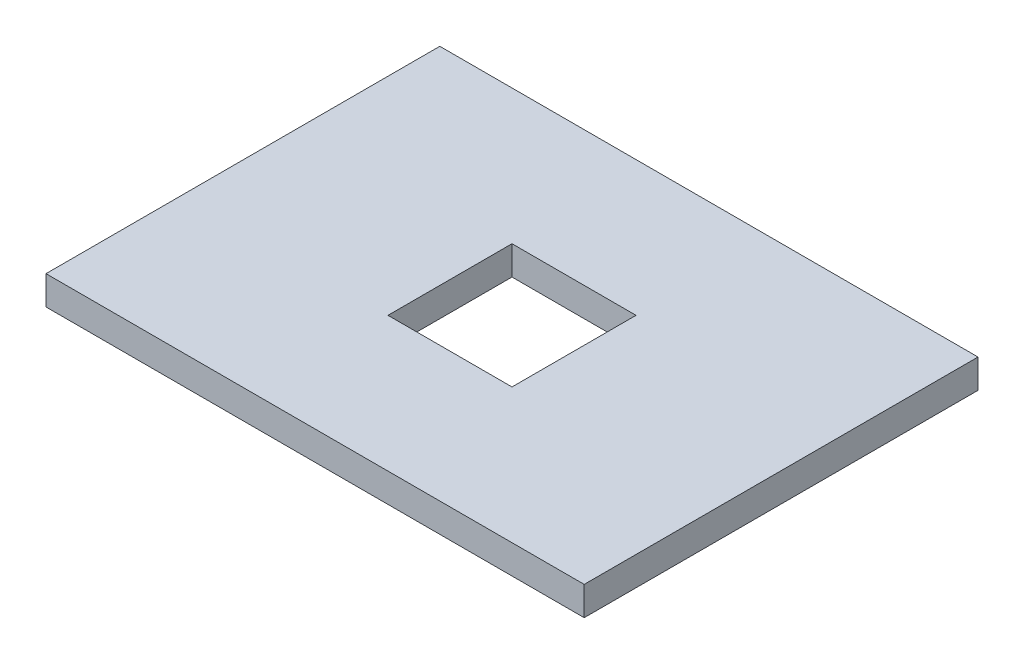
ISO-10303-21;
HEADER;
FILE_DESCRIPTION(('STEP AP214'),'2;1');
FILE_NAME('part.step','',(''),(''),'','','');
FILE_SCHEMA(('AUTOMOTIVE_DESIGN { 1 0 10303 214 1 1 1 1 }'));
ENDSEC;
DATA;
#1=APPLICATION_CONTEXT('core data for automotive mechanical design processes');
#2=APPLICATION_PROTOCOL_DEFINITION('international standard','automotive_design',2000,#1);
#3=PRODUCT_CONTEXT('',#1,'mechanical');
#4=PRODUCT('Part','Part','',(#3));
#5=PRODUCT_RELATED_PRODUCT_CATEGORY('part','',(#4));
#6=PRODUCT_DEFINITION_FORMATION('','',#4);
#7=PRODUCT_DEFINITION_CONTEXT('part definition',#1,'design');
#8=PRODUCT_DEFINITION('design','',#6,#7);
#9=PRODUCT_DEFINITION_SHAPE('','',#8);
#10=(LENGTH_UNIT() NAMED_UNIT(*) SI_UNIT(.MILLI.,.METRE.));
#11=(NAMED_UNIT(*) PLANE_ANGLE_UNIT() SI_UNIT($,.RADIAN.));
#12=(NAMED_UNIT(*) SI_UNIT($,.STERADIAN.) SOLID_ANGLE_UNIT());
#13=UNCERTAINTY_MEASURE_WITH_UNIT(LENGTH_MEASURE(1.E-05),#10,'distance_accuracy_value','');
#14=(GEOMETRIC_REPRESENTATION_CONTEXT(3) GLOBAL_UNCERTAINTY_ASSIGNED_CONTEXT((#13)) GLOBAL_UNIT_ASSIGNED_CONTEXT((#10,
#11,#12)) REPRESENTATION_CONTEXT('',''));
#15=CARTESIAN_POINT('',(0.,0.,0.));
#16=DIRECTION('',(0.,0.,1.));
#17=DIRECTION('',(1.,0.,0.));
#18=AXIS2_PLACEMENT_3D('',#15,#16,#17);
#19=CARTESIAN_POINT('',(130.175,13.97,95.25));
#20=DIRECTION('',(-1.,0.,0.));
#21=DIRECTION('',(0.,0.,1.));
#22=AXIS2_PLACEMENT_3D('',#19,#20,#21);
#23=PLANE('',#22);
#24=DIRECTION('',(0.,0.,-1.));
#25=VECTOR('',#24,1.);
#26=CARTESIAN_POINT('',(130.175,0.,95.25));
#27=LINE('',#26,#25);
#28=CARTESIAN_POINT('',(130.175,0.,95.25));
#29=VERTEX_POINT('',#28);
#30=CARTESIAN_POINT('',(130.175,0.,-95.25));
#31=VERTEX_POINT('',#30);
#32=EDGE_CURVE('E149',#29,#31,#27,.T.);
#33=ORIENTED_EDGE('',*,*,#32,.T.);
#34=DIRECTION('',(0.,-1.,0.));
#35=VECTOR('',#34,1.);
#36=CARTESIAN_POINT('',(130.175,13.97,-95.25));
#37=LINE('',#36,#35);
#38=CARTESIAN_POINT('',(130.175,13.97,-95.25));
#39=VERTEX_POINT('',#38);
#40=EDGE_CURVE('E11',#39,#31,#37,.T.);
#41=ORIENTED_EDGE('',*,*,#40,.F.);
#42=DIRECTION('',(0.,0.,-1.));
#43=VECTOR('',#42,1.);
#44=CARTESIAN_POINT('',(130.175,13.97,95.25));
#45=LINE('',#44,#43);
#46=CARTESIAN_POINT('',(130.175,13.97,95.25));
#47=VERTEX_POINT('',#46);
#48=EDGE_CURVE('E155',#47,#39,#45,.T.);
#49=ORIENTED_EDGE('',*,*,#48,.F.);
#50=DIRECTION('',(0.,-1.,0.));
#51=VECTOR('',#50,1.);
#52=CARTESIAN_POINT('',(130.175,13.97,95.25));
#53=LINE('',#52,#51);
#54=EDGE_CURVE('E169',#47,#29,#53,.T.);
#55=ORIENTED_EDGE('',*,*,#54,.T.);
#56=EDGE_LOOP('',(#33,#41,#49,#55));
#57=FACE_BOUND('',#56,.T.);
#58=ADVANCED_FACE('F41',(#57),#23,.F.);
#59=CARTESIAN_POINT('',(-130.175,13.97,-95.25));
#60=DIRECTION('',(0.,0.,1.));
#61=DIRECTION('',(1.,0.,0.));
#62=AXIS2_PLACEMENT_3D('',#59,#60,#61);
#63=PLANE('',#62);
#64=DIRECTION('',(-1.,0.,0.));
#65=VECTOR('',#64,1.);
#66=CARTESIAN_POINT('',(-130.175,0.,-95.25));
#67=LINE('',#66,#65);
#68=CARTESIAN_POINT('',(-130.175,0.,-95.25));
#69=VERTEX_POINT('',#68);
#70=EDGE_CURVE('E173',#31,#69,#67,.T.);
#71=ORIENTED_EDGE('',*,*,#70,.T.);
#72=DIRECTION('',(0.,-1.,0.));
#73=VECTOR('',#72,1.);
#74=CARTESIAN_POINT('',(-130.175,13.97,-95.25));
#75=LINE('',#74,#73);
#76=CARTESIAN_POINT('',(-130.175,13.97,-95.25));
#77=VERTEX_POINT('',#76);
#78=EDGE_CURVE('E49',#77,#69,#75,.T.);
#79=ORIENTED_EDGE('',*,*,#78,.F.);
#80=DIRECTION('',(-1.,0.,0.));
#81=VECTOR('',#80,1.);
#82=CARTESIAN_POINT('',(-130.175,13.97,-95.25));
#83=LINE('',#82,#81);
#84=EDGE_CURVE('E159',#39,#77,#83,.T.);
#85=ORIENTED_EDGE('',*,*,#84,.F.);
#86=ORIENTED_EDGE('',*,*,#40,.T.);
#87=EDGE_LOOP('',(#71,#79,#85,#86));
#88=FACE_BOUND('',#87,.T.);
#89=ADVANCED_FACE('F207',(#88),#63,.F.);
#90=CARTESIAN_POINT('',(-130.175,13.97,95.25));
#91=DIRECTION('',(1.,0.,0.));
#92=DIRECTION('',(0.,0.,-1.));
#93=AXIS2_PLACEMENT_3D('',#90,#91,#92);
#94=PLANE('',#93);
#95=DIRECTION('',(0.,0.,1.));
#96=VECTOR('',#95,1.);
#97=CARTESIAN_POINT('',(-130.175,0.,95.25));
#98=LINE('',#97,#96);
#99=CARTESIAN_POINT('',(-130.175,0.,95.25));
#100=VERTEX_POINT('',#99);
#101=EDGE_CURVE('E176',#69,#100,#98,.T.);
#102=ORIENTED_EDGE('',*,*,#101,.T.);
#103=DIRECTION('',(0.,-1.,0.));
#104=VECTOR('',#103,1.);
#105=CARTESIAN_POINT('',(-130.175,13.97,95.25));
#106=LINE('',#105,#104);
#107=CARTESIAN_POINT('',(-130.175,13.97,95.25));
#108=VERTEX_POINT('',#107);
#109=EDGE_CURVE('E184',#108,#100,#106,.T.);
#110=ORIENTED_EDGE('',*,*,#109,.F.);
#111=DIRECTION('',(0.,0.,1.));
#112=VECTOR('',#111,1.);
#113=CARTESIAN_POINT('',(-130.175,13.97,95.25));
#114=LINE('',#113,#112);
#115=EDGE_CURVE('E163',#77,#108,#114,.T.);
#116=ORIENTED_EDGE('',*,*,#115,.F.);
#117=ORIENTED_EDGE('',*,*,#78,.T.);
#118=EDGE_LOOP('',(#102,#110,#116,#117));
#119=FACE_BOUND('',#118,.T.);
#120=ADVANCED_FACE('F193',(#119),#94,.F.);
#121=CARTESIAN_POINT('',(-130.175,13.97,95.25));
#122=DIRECTION('',(0.,0.,-1.));
#123=DIRECTION('',(-1.,0.,0.));
#124=AXIS2_PLACEMENT_3D('',#121,#122,#123);
#125=PLANE('',#124);
#126=DIRECTION('',(1.,0.,0.));
#127=VECTOR('',#126,1.);
#128=CARTESIAN_POINT('',(-130.175,0.,95.25));
#129=LINE('',#128,#127);
#130=EDGE_CURVE('E160',#100,#29,#129,.T.);
#131=ORIENTED_EDGE('',*,*,#130,.T.);
#132=ORIENTED_EDGE('',*,*,#54,.F.);
#133=DIRECTION('',(1.,0.,0.));
#134=VECTOR('',#133,1.);
#135=CARTESIAN_POINT('',(-130.175,13.97,95.25));
#136=LINE('',#135,#134);
#137=EDGE_CURVE('E166',#108,#47,#136,.T.);
#138=ORIENTED_EDGE('',*,*,#137,.F.);
#139=ORIENTED_EDGE('',*,*,#109,.T.);
#140=EDGE_LOOP('',(#131,#132,#138,#139));
#141=FACE_BOUND('',#140,.T.);
#142=ADVANCED_FACE('F200',(#141),#125,.F.);
#143=CARTESIAN_POINT('',(0.,13.97,0.));
#144=DIRECTION('',(0.,-1.,0.));
#145=DIRECTION('',(0.,0.,-1.));
#146=AXIS2_PLACEMENT_3D('',#143,#144,#145);
#147=PLANE('',#146);
#148=DIRECTION('',(-1.,0.,0.));
#149=VECTOR('',#148,1.);
#150=CARTESIAN_POINT('',(-30.,13.97,-30.));
#151=LINE('',#150,#149);
#152=CARTESIAN_POINT('',(30.,13.97,-30.));
#153=VERTEX_POINT('',#152);
#154=CARTESIAN_POINT('',(-30.,13.97,-30.));
#155=VERTEX_POINT('',#154);
#156=EDGE_CURVE('E140',#153,#155,#151,.T.);
#157=ORIENTED_EDGE('',*,*,#156,.F.);
#158=DIRECTION('',(0.,0.,-1.));
#159=VECTOR('',#158,1.);
#160=CARTESIAN_POINT('',(30.,13.97,30.));
#161=LINE('',#160,#159);
#162=CARTESIAN_POINT('',(30.,13.97,30.));
#163=VERTEX_POINT('',#162);
#164=EDGE_CURVE('E56',#163,#153,#161,.T.);
#165=ORIENTED_EDGE('',*,*,#164,.F.);
#166=DIRECTION('',(1.,0.,0.));
#167=VECTOR('',#166,1.);
#168=CARTESIAN_POINT('',(-30.,13.97,30.));
#169=LINE('',#168,#167);
#170=CARTESIAN_POINT('',(-30.,13.97,30.));
#171=VERTEX_POINT('',#170);
#172=EDGE_CURVE('E127',#171,#163,#169,.T.);
#173=ORIENTED_EDGE('',*,*,#172,.F.);
#174=DIRECTION('',(0.,0.,1.));
#175=VECTOR('',#174,1.);
#176=CARTESIAN_POINT('',(-30.,13.97,30.));
#177=LINE('',#176,#175);
#178=EDGE_CURVE('E131',#155,#171,#177,.T.);
#179=ORIENTED_EDGE('',*,*,#178,.F.);
#180=EDGE_LOOP('',(#157,#165,#173,#179));
#181=FACE_BOUND('',#180,.T.);
#182=ORIENTED_EDGE('',*,*,#48,.T.);
#183=ORIENTED_EDGE('',*,*,#84,.T.);
#184=ORIENTED_EDGE('',*,*,#115,.T.);
#185=ORIENTED_EDGE('',*,*,#137,.T.);
#186=EDGE_LOOP('',(#182,#183,#184,#185));
#187=FACE_BOUND('',#186,.T.);
#188=ADVANCED_FACE('F206',(#181,#187),#147,.F.);
#189=CARTESIAN_POINT('',(0.,0.,0.));
#190=DIRECTION('',(0.,-1.,0.));
#191=DIRECTION('',(0.,0.,-1.));
#192=AXIS2_PLACEMENT_3D('',#189,#190,#191);
#193=PLANE('',#192);
#194=DIRECTION('',(0.,0.,-1.));
#195=VECTOR('',#194,1.);
#196=CARTESIAN_POINT('',(30.,0.,30.));
#197=LINE('',#196,#195);
#198=CARTESIAN_POINT('',(30.,0.,30.));
#199=VERTEX_POINT('',#198);
#200=CARTESIAN_POINT('',(30.,0.,-30.));
#201=VERTEX_POINT('',#200);
#202=EDGE_CURVE('E108',#199,#201,#197,.T.);
#203=ORIENTED_EDGE('',*,*,#202,.T.);
#204=DIRECTION('',(-1.,0.,0.));
#205=VECTOR('',#204,1.);
#206=CARTESIAN_POINT('',(-30.,0.,-30.));
#207=LINE('',#206,#205);
#208=CARTESIAN_POINT('',(-30.,0.,-30.));
#209=VERTEX_POINT('',#208);
#210=EDGE_CURVE('E118',#201,#209,#207,.T.);
#211=ORIENTED_EDGE('',*,*,#210,.T.);
#212=DIRECTION('',(0.,0.,1.));
#213=VECTOR('',#212,1.);
#214=CARTESIAN_POINT('',(-30.,0.,30.));
#215=LINE('',#214,#213);
#216=CARTESIAN_POINT('',(-30.,0.,30.));
#217=VERTEX_POINT('',#216);
#218=EDGE_CURVE('E64',#209,#217,#215,.T.);
#219=ORIENTED_EDGE('',*,*,#218,.T.);
#220=DIRECTION('',(1.,0.,0.));
#221=VECTOR('',#220,1.);
#222=CARTESIAN_POINT('',(-30.,0.,30.));
#223=LINE('',#222,#221);
#224=EDGE_CURVE('E115',#217,#199,#223,.T.);
#225=ORIENTED_EDGE('',*,*,#224,.T.);
#226=EDGE_LOOP('',(#203,#211,#219,#225));
#227=FACE_BOUND('',#226,.T.);
#228=ORIENTED_EDGE('',*,*,#32,.F.);
#229=ORIENTED_EDGE('',*,*,#130,.F.);
#230=ORIENTED_EDGE('',*,*,#101,.F.);
#231=ORIENTED_EDGE('',*,*,#70,.F.);
#232=EDGE_LOOP('',(#228,#229,#230,#231));
#233=FACE_BOUND('',#232,.T.);
#234=ADVANCED_FACE('F123',(#227,#233),#193,.T.);
#235=CARTESIAN_POINT('',(30.,0.,30.));
#236=DIRECTION('',(1.,0.,0.));
#237=DIRECTION('',(0.,0.,-1.));
#238=AXIS2_PLACEMENT_3D('',#235,#236,#237);
#239=PLANE('',#238);
#240=ORIENTED_EDGE('',*,*,#164,.T.);
#241=DIRECTION('',(0.,1.,0.));
#242=VECTOR('',#241,1.);
#243=CARTESIAN_POINT('',(30.,0.,-30.));
#244=LINE('',#243,#242);
#245=EDGE_CURVE('E104',#201,#153,#244,.T.);
#246=ORIENTED_EDGE('',*,*,#245,.F.);
#247=ORIENTED_EDGE('',*,*,#202,.F.);
#248=DIRECTION('',(0.,1.,0.));
#249=VECTOR('',#248,1.);
#250=CARTESIAN_POINT('',(30.,0.,30.));
#251=LINE('',#250,#249);
#252=EDGE_CURVE('E146',#199,#163,#251,.T.);
#253=ORIENTED_EDGE('',*,*,#252,.T.);
#254=EDGE_LOOP('',(#240,#246,#247,#253));
#255=FACE_BOUND('',#254,.T.);
#256=ADVANCED_FACE('F106',(#255),#239,.F.);
#257=CARTESIAN_POINT('',(-30.,0.,30.));
#258=DIRECTION('',(0.,0.,1.));
#259=DIRECTION('',(1.,0.,0.));
#260=AXIS2_PLACEMENT_3D('',#257,#258,#259);
#261=PLANE('',#260);
#262=ORIENTED_EDGE('',*,*,#172,.T.);
#263=ORIENTED_EDGE('',*,*,#252,.F.);
#264=ORIENTED_EDGE('',*,*,#224,.F.);
#265=DIRECTION('',(0.,1.,0.));
#266=VECTOR('',#265,1.);
#267=CARTESIAN_POINT('',(-30.,0.,30.));
#268=LINE('',#267,#266);
#269=EDGE_CURVE('E150',#217,#171,#268,.T.);
#270=ORIENTED_EDGE('',*,*,#269,.T.);
#271=EDGE_LOOP('',(#262,#263,#264,#270));
#272=FACE_BOUND('',#271,.T.);
#273=ADVANCED_FACE('F224',(#272),#261,.F.);
#274=CARTESIAN_POINT('',(-30.,0.,30.));
#275=DIRECTION('',(-1.,0.,0.));
#276=DIRECTION('',(0.,0.,1.));
#277=AXIS2_PLACEMENT_3D('',#274,#275,#276);
#278=PLANE('',#277);
#279=ORIENTED_EDGE('',*,*,#178,.T.);
#280=ORIENTED_EDGE('',*,*,#269,.F.);
#281=ORIENTED_EDGE('',*,*,#218,.F.);
#282=DIRECTION('',(0.,1.,0.));
#283=VECTOR('',#282,1.);
#284=CARTESIAN_POINT('',(-30.,0.,-30.));
#285=LINE('',#284,#283);
#286=EDGE_CURVE('E114',#209,#155,#285,.T.);
#287=ORIENTED_EDGE('',*,*,#286,.T.);
#288=EDGE_LOOP('',(#279,#280,#281,#287));
#289=FACE_BOUND('',#288,.T.);
#290=ADVANCED_FACE('F227',(#289),#278,.F.);
#291=CARTESIAN_POINT('',(-30.,0.,-30.));
#292=DIRECTION('',(0.,0.,-1.));
#293=DIRECTION('',(-1.,0.,0.));
#294=AXIS2_PLACEMENT_3D('',#291,#292,#293);
#295=PLANE('',#294);
#296=ORIENTED_EDGE('',*,*,#156,.T.);
#297=ORIENTED_EDGE('',*,*,#286,.F.);
#298=ORIENTED_EDGE('',*,*,#210,.F.);
#299=ORIENTED_EDGE('',*,*,#245,.T.);
#300=EDGE_LOOP('',(#296,#297,#298,#299));
#301=FACE_BOUND('',#300,.T.);
#302=ADVANCED_FACE('F119',(#301),#295,.F.);
#303=CLOSED_SHELL('',(#58,#89,#120,#142,#188,#234,#256,#273,#290,#302));
#304=MANIFOLD_SOLID_BREP('B2',#303);
#305=ADVANCED_BREP_SHAPE_REPRESENTATION('',(#18,#304),#14);
#306=SHAPE_DEFINITION_REPRESENTATION(#9,#305);
ENDSEC;
END-ISO-10303-21;
